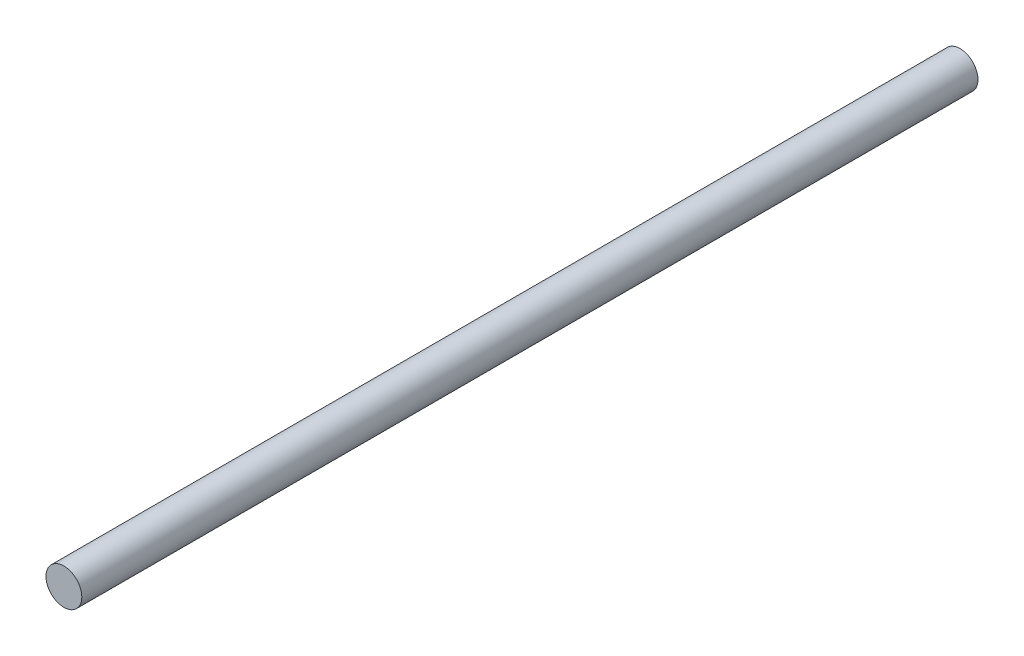
ISO-10303-21;
HEADER;
FILE_DESCRIPTION(('STEP AP214'),'2;1');
FILE_NAME('part.step','',(''),(''),'','','');
FILE_SCHEMA(('AUTOMOTIVE_DESIGN { 1 0 10303 214 1 1 1 1 }'));
ENDSEC;
DATA;
#1=APPLICATION_CONTEXT('core data for automotive mechanical design processes');
#2=APPLICATION_PROTOCOL_DEFINITION('international standard','automotive_design',2000,#1);
#3=PRODUCT_CONTEXT('',#1,'mechanical');
#4=PRODUCT('Part','Part','',(#3));
#5=PRODUCT_RELATED_PRODUCT_CATEGORY('part','',(#4));
#6=PRODUCT_DEFINITION_FORMATION('','',#4);
#7=PRODUCT_DEFINITION_CONTEXT('part definition',#1,'design');
#8=PRODUCT_DEFINITION('design','',#6,#7);
#9=PRODUCT_DEFINITION_SHAPE('','',#8);
#10=(LENGTH_UNIT() NAMED_UNIT(*) SI_UNIT(.MILLI.,.METRE.));
#11=(NAMED_UNIT(*) PLANE_ANGLE_UNIT() SI_UNIT($,.RADIAN.));
#12=(NAMED_UNIT(*) SI_UNIT($,.STERADIAN.) SOLID_ANGLE_UNIT());
#13=UNCERTAINTY_MEASURE_WITH_UNIT(LENGTH_MEASURE(1.E-05),#10,'distance_accuracy_value','');
#14=(GEOMETRIC_REPRESENTATION_CONTEXT(3) GLOBAL_UNCERTAINTY_ASSIGNED_CONTEXT((#13)) GLOBAL_UNIT_ASSIGNED_CONTEXT((#10,
#11,#12)) REPRESENTATION_CONTEXT('',''));
#15=CARTESIAN_POINT('',(0.,0.,0.));
#16=DIRECTION('',(0.,0.,1.));
#17=DIRECTION('',(1.,0.,0.));
#18=AXIS2_PLACEMENT_3D('',#15,#16,#17);
#19=CARTESIAN_POINT('',(0.,0.,1000.));
#20=DIRECTION('',(0.,0.,-1.));
#21=DIRECTION('',(-1.,0.,0.));
#22=AXIS2_PLACEMENT_3D('',#19,#20,#21);
#23=CYLINDRICAL_SURFACE('',#22,20.);
#24=CARTESIAN_POINT('',(0.,0.,1000.));
#25=DIRECTION('',(0.,0.,1.));
#26=DIRECTION('',(1.,0.,0.));
#27=AXIS2_PLACEMENT_3D('',#24,#25,#26);
#28=CIRCLE('',#27,20.);
#29=CARTESIAN_POINT('',(20.,0.,1000.));
#30=VERTEX_POINT('',#29);
#31=EDGE_CURVE('E10',#30,#30,#28,.T.);
#32=ORIENTED_EDGE('',*,*,#31,.F.);
#33=EDGE_LOOP('',(#32));
#34=FACE_BOUND('',#33,.T.);
#35=CARTESIAN_POINT('',(0.,0.,0.));
#36=DIRECTION('',(0.,0.,1.));
#37=DIRECTION('',(1.,0.,0.));
#38=AXIS2_PLACEMENT_3D('',#35,#36,#37);
#39=CIRCLE('',#38,20.);
#40=CARTESIAN_POINT('',(20.,0.,0.));
#41=VERTEX_POINT('',#40);
#42=EDGE_CURVE('E37',#41,#41,#39,.T.);
#43=ORIENTED_EDGE('',*,*,#42,.T.);
#44=EDGE_LOOP('',(#43));
#45=FACE_BOUND('',#44,.T.);
#46=ADVANCED_FACE('F34',(#34,#45),#23,.T.);
#47=CARTESIAN_POINT('',(0.,0.,1000.));
#48=DIRECTION('',(0.,0.,1.));
#49=DIRECTION('',(1.,0.,0.));
#50=AXIS2_PLACEMENT_3D('',#47,#48,#49);
#51=PLANE('',#50);
#52=ORIENTED_EDGE('',*,*,#31,.T.);
#53=EDGE_LOOP('',(#52));
#54=FACE_BOUND('',#53,.T.);
#55=ADVANCED_FACE('F49',(#54),#51,.T.);
#56=CARTESIAN_POINT('',(0.,0.,0.));
#57=DIRECTION('',(0.,0.,1.));
#58=DIRECTION('',(1.,0.,0.));
#59=AXIS2_PLACEMENT_3D('',#56,#57,#58);
#60=PLANE('',#59);
#61=ORIENTED_EDGE('',*,*,#42,.F.);
#62=EDGE_LOOP('',(#61));
#63=FACE_BOUND('',#62,.T.);
#64=ADVANCED_FACE('F47',(#63),#60,.F.);
#65=CLOSED_SHELL('',(#46,#55,#64));
#66=MANIFOLD_SOLID_BREP('B2',#65);
#67=ADVANCED_BREP_SHAPE_REPRESENTATION('',(#18,#66),#14);
#68=SHAPE_DEFINITION_REPRESENTATION(#9,#67);
ENDSEC;
END-ISO-10303-21;
